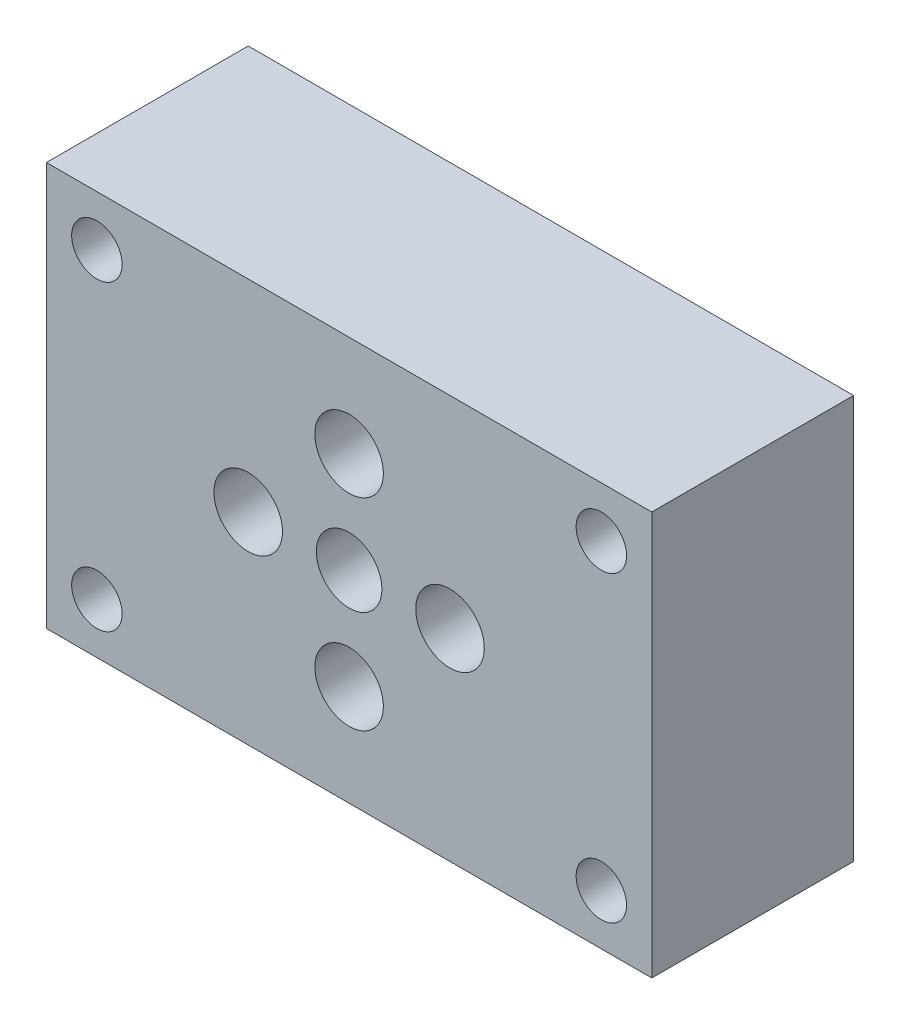
ISO-10303-21;
HEADER;
FILE_DESCRIPTION(('STEP AP214'),'2;1');
FILE_NAME('part.step','',(''),(''),'','','');
FILE_SCHEMA(('AUTOMOTIVE_DESIGN { 1 0 10303 214 1 1 1 1 }'));
ENDSEC;
DATA;
#1=APPLICATION_CONTEXT('core data for automotive mechanical design processes');
#2=APPLICATION_PROTOCOL_DEFINITION('international standard','automotive_design',2000,#1);
#3=PRODUCT_CONTEXT('',#1,'mechanical');
#4=PRODUCT('Part','Part','',(#3));
#5=PRODUCT_RELATED_PRODUCT_CATEGORY('part','',(#4));
#6=PRODUCT_DEFINITION_FORMATION('','',#4);
#7=PRODUCT_DEFINITION_CONTEXT('part definition',#1,'design');
#8=PRODUCT_DEFINITION('design','',#6,#7);
#9=PRODUCT_DEFINITION_SHAPE('','',#8);
#10=(LENGTH_UNIT() NAMED_UNIT(*) SI_UNIT(.MILLI.,.METRE.));
#11=(NAMED_UNIT(*) PLANE_ANGLE_UNIT() SI_UNIT($,.RADIAN.));
#12=(NAMED_UNIT(*) SI_UNIT($,.STERADIAN.) SOLID_ANGLE_UNIT());
#13=UNCERTAINTY_MEASURE_WITH_UNIT(LENGTH_MEASURE(1.E-05),#10,'distance_accuracy_value','');
#14=(GEOMETRIC_REPRESENTATION_CONTEXT(3) GLOBAL_UNCERTAINTY_ASSIGNED_CONTEXT((#13)) GLOBAL_UNIT_ASSIGNED_CONTEXT((#10,
#11,#12)) REPRESENTATION_CONTEXT('',''));
#15=CARTESIAN_POINT('',(0.,0.,0.));
#16=DIRECTION('',(0.,0.,1.));
#17=DIRECTION('',(1.,0.,0.));
#18=AXIS2_PLACEMENT_3D('',#15,#16,#17);
#19=CARTESIAN_POINT('',(0.,0.,25.4));
#20=DIRECTION('',(0.,0.,-1.));
#21=DIRECTION('',(-1.,0.,0.));
#22=AXIS2_PLACEMENT_3D('',#19,#20,#21);
#23=PLANE('',#22);
#24=CARTESIAN_POINT('',(69.8500000000004,6.34999999999999,25.4));
#25=DIRECTION('',(0.,0.,1.));
#26=DIRECTION('',(1.,0.,0.));
#27=AXIS2_PLACEMENT_3D('',#24,#25,#26);
#28=CIRCLE('',#27,3.175);
#29=CARTESIAN_POINT('',(73.0250000000004,6.34999999999999,25.4));
#30=VERTEX_POINT('',#29);
#31=EDGE_CURVE('E144',#30,#30,#28,.T.);
#32=ORIENTED_EDGE('',*,*,#31,.F.);
#33=EDGE_LOOP('',(#32));
#34=FACE_BOUND('',#33,.T.);
#35=CARTESIAN_POINT('',(6.3500000000004,6.34999999999999,25.4));
#36=DIRECTION('',(0.,0.,1.));
#37=DIRECTION('',(1.,0.,0.));
#38=AXIS2_PLACEMENT_3D('',#35,#36,#37);
#39=CIRCLE('',#38,3.175);
#40=CARTESIAN_POINT('',(9.5250000000004,6.34999999999999,25.4));
#41=VERTEX_POINT('',#40);
#42=EDGE_CURVE('E150',#41,#41,#39,.T.);
#43=ORIENTED_EDGE('',*,*,#42,.F.);
#44=EDGE_LOOP('',(#43));
#45=FACE_BOUND('',#44,.T.);
#46=CARTESIAN_POINT('',(69.85,44.45,25.4));
#47=DIRECTION('',(0.,0.,1.));
#48=DIRECTION('',(1.,0.,0.));
#49=AXIS2_PLACEMENT_3D('',#46,#47,#48);
#50=CIRCLE('',#49,3.175);
#51=CARTESIAN_POINT('',(73.025,44.45,25.4));
#52=VERTEX_POINT('',#51);
#53=EDGE_CURVE('E156',#52,#52,#50,.T.);
#54=ORIENTED_EDGE('',*,*,#53,.F.);
#55=EDGE_LOOP('',(#54));
#56=FACE_BOUND('',#55,.T.);
#57=CARTESIAN_POINT('',(6.35,44.45,25.4));
#58=DIRECTION('',(0.,0.,1.));
#59=DIRECTION('',(1.,0.,0.));
#60=AXIS2_PLACEMENT_3D('',#57,#58,#59);
#61=CIRCLE('',#60,3.175);
#62=CARTESIAN_POINT('',(9.525,44.45,25.4));
#63=VERTEX_POINT('',#62);
#64=EDGE_CURVE('E162',#63,#63,#61,.T.);
#65=ORIENTED_EDGE('',*,*,#64,.F.);
#66=EDGE_LOOP('',(#65));
#67=FACE_BOUND('',#66,.T.);
#68=CARTESIAN_POINT('',(38.1,25.4,25.4));
#69=DIRECTION('',(0.,0.,1.));
#70=DIRECTION('',(1.,0.,0.));
#71=AXIS2_PLACEMENT_3D('',#68,#69,#70);
#72=CIRCLE('',#71,4.1275);
#73=CARTESIAN_POINT('',(42.2275,25.4,25.4));
#74=VERTEX_POINT('',#73);
#75=EDGE_CURVE('E138',#74,#74,#72,.T.);
#76=ORIENTED_EDGE('',*,*,#75,.F.);
#77=EDGE_LOOP('',(#76));
#78=FACE_BOUND('',#77,.T.);
#79=DIRECTION('',(0.,-1.,0.));
#80=VECTOR('',#79,1.);
#81=CARTESIAN_POINT('',(0.,0.,25.4));
#82=LINE('',#81,#80);
#83=CARTESIAN_POINT('',(0.,50.8,25.4));
#84=VERTEX_POINT('',#83);
#85=CARTESIAN_POINT('',(0.,0.,25.4));
#86=VERTEX_POINT('',#85);
#87=EDGE_CURVE('E87',#84,#86,#82,.T.);
#88=ORIENTED_EDGE('',*,*,#87,.T.);
#89=DIRECTION('',(1.,0.,0.));
#90=VECTOR('',#89,1.);
#91=CARTESIAN_POINT('',(0.,0.,25.4));
#92=LINE('',#91,#90);
#93=CARTESIAN_POINT('',(76.2,0.,25.4));
#94=VERTEX_POINT('',#93);
#95=EDGE_CURVE('E82',#86,#94,#92,.T.);
#96=ORIENTED_EDGE('',*,*,#95,.T.);
#97=DIRECTION('',(0.,1.,0.));
#98=VECTOR('',#97,1.);
#99=CARTESIAN_POINT('',(76.2,0.,25.4));
#100=LINE('',#99,#98);
#101=CARTESIAN_POINT('',(76.2,50.8,25.4));
#102=VERTEX_POINT('',#101);
#103=EDGE_CURVE('E85',#94,#102,#100,.T.);
#104=ORIENTED_EDGE('',*,*,#103,.T.);
#105=DIRECTION('',(-1.,0.,0.));
#106=VECTOR('',#105,1.);
#107=CARTESIAN_POINT('',(0.,50.8,25.4));
#108=LINE('',#107,#106);
#109=EDGE_CURVE('E52',#102,#84,#108,.T.);
#110=ORIENTED_EDGE('',*,*,#109,.T.);
#111=EDGE_LOOP('',(#88,#96,#104,#110));
#112=FACE_BOUND('',#111,.T.);
#113=CARTESIAN_POINT('',(38.1,38.1,25.4));
#114=DIRECTION('',(0.,0.,1.));
#115=DIRECTION('',(1.,0.,0.));
#116=AXIS2_PLACEMENT_3D('',#113,#114,#115);
#117=CIRCLE('',#116,4.31365531011594);
#118=CARTESIAN_POINT('',(42.4136553101159,38.1,25.4));
#119=VERTEX_POINT('',#118);
#120=EDGE_CURVE('E102',#119,#119,#117,.T.);
#121=ORIENTED_EDGE('',*,*,#120,.F.);
#122=EDGE_LOOP('',(#121));
#123=FACE_BOUND('',#122,.T.);
#124=CARTESIAN_POINT('',(50.8000000000044,25.4000000000044,25.4));
#125=DIRECTION('',(0.,0.,1.));
#126=DIRECTION('',(1.,0.,0.));
#127=AXIS2_PLACEMENT_3D('',#124,#125,#126);
#128=CIRCLE('',#127,4.31365531011594);
#129=CARTESIAN_POINT('',(55.1136553101204,25.4000000000044,25.4));
#130=VERTEX_POINT('',#129);
#131=EDGE_CURVE('E117',#130,#130,#128,.T.);
#132=ORIENTED_EDGE('',*,*,#131,.F.);
#133=EDGE_LOOP('',(#132));
#134=FACE_BOUND('',#133,.T.);
#135=CARTESIAN_POINT('',(38.1000000000088,12.7,25.4));
#136=DIRECTION('',(0.,0.,1.));
#137=DIRECTION('',(1.,0.,0.));
#138=AXIS2_PLACEMENT_3D('',#135,#136,#137);
#139=CIRCLE('',#138,4.31365531011594);
#140=CARTESIAN_POINT('',(42.4136553101248,12.7,25.4));
#141=VERTEX_POINT('',#140);
#142=EDGE_CURVE('E123',#141,#141,#139,.T.);
#143=ORIENTED_EDGE('',*,*,#142,.F.);
#144=EDGE_LOOP('',(#143));
#145=FACE_BOUND('',#144,.T.);
#146=CARTESIAN_POINT('',(25.4000000000044,25.3999999999957,25.4));
#147=DIRECTION('',(0.,0.,1.));
#148=DIRECTION('',(1.,0.,0.));
#149=AXIS2_PLACEMENT_3D('',#146,#147,#148);
#150=CIRCLE('',#149,4.31365531011593);
#151=CARTESIAN_POINT('',(29.7136553101204,25.3999999999957,25.4));
#152=VERTEX_POINT('',#151);
#153=EDGE_CURVE('E129',#152,#152,#150,.T.);
#154=ORIENTED_EDGE('',*,*,#153,.F.);
#155=EDGE_LOOP('',(#154));
#156=FACE_BOUND('',#155,.T.);
#157=ADVANCED_FACE('F35',(#34,#45,#56,#67,#78,#112,#123,#134,#145,#156),#23,.F.);
#158=CARTESIAN_POINT('',(0.,0.,0.));
#159=DIRECTION('',(0.,0.,-1.));
#160=DIRECTION('',(-1.,0.,0.));
#161=AXIS2_PLACEMENT_3D('',#158,#159,#160);
#162=PLANE('',#161);
#163=CARTESIAN_POINT('',(69.8500000000004,6.34999999999999,0.));
#164=DIRECTION('',(0.,0.,1.));
#165=DIRECTION('',(1.,0.,0.));
#166=AXIS2_PLACEMENT_3D('',#163,#164,#165);
#167=CIRCLE('',#166,3.175);
#168=CARTESIAN_POINT('',(73.0250000000004,6.34999999999999,0.));
#169=VERTEX_POINT('',#168);
#170=EDGE_CURVE('E147',#169,#169,#167,.T.);
#171=ORIENTED_EDGE('',*,*,#170,.T.);
#172=EDGE_LOOP('',(#171));
#173=FACE_BOUND('',#172,.T.);
#174=CARTESIAN_POINT('',(6.3500000000004,6.34999999999999,0.));
#175=DIRECTION('',(0.,0.,1.));
#176=DIRECTION('',(1.,0.,0.));
#177=AXIS2_PLACEMENT_3D('',#174,#175,#176);
#178=CIRCLE('',#177,3.175);
#179=CARTESIAN_POINT('',(9.5250000000004,6.34999999999999,0.));
#180=VERTEX_POINT('',#179);
#181=EDGE_CURVE('E153',#180,#180,#178,.T.);
#182=ORIENTED_EDGE('',*,*,#181,.T.);
#183=EDGE_LOOP('',(#182));
#184=FACE_BOUND('',#183,.T.);
#185=CARTESIAN_POINT('',(69.85,44.45,0.));
#186=DIRECTION('',(0.,0.,1.));
#187=DIRECTION('',(1.,0.,0.));
#188=AXIS2_PLACEMENT_3D('',#185,#186,#187);
#189=CIRCLE('',#188,3.175);
#190=CARTESIAN_POINT('',(73.025,44.45,0.));
#191=VERTEX_POINT('',#190);
#192=EDGE_CURVE('E159',#191,#191,#189,.T.);
#193=ORIENTED_EDGE('',*,*,#192,.T.);
#194=EDGE_LOOP('',(#193));
#195=FACE_BOUND('',#194,.T.);
#196=CARTESIAN_POINT('',(6.35,44.45,0.));
#197=DIRECTION('',(0.,0.,1.));
#198=DIRECTION('',(1.,0.,0.));
#199=AXIS2_PLACEMENT_3D('',#196,#197,#198);
#200=CIRCLE('',#199,3.175);
#201=CARTESIAN_POINT('',(9.525,44.45,0.));
#202=VERTEX_POINT('',#201);
#203=EDGE_CURVE('E141',#202,#202,#200,.T.);
#204=ORIENTED_EDGE('',*,*,#203,.T.);
#205=EDGE_LOOP('',(#204));
#206=FACE_BOUND('',#205,.T.);
#207=CARTESIAN_POINT('',(38.1,25.4,0.));
#208=DIRECTION('',(0.,0.,1.));
#209=DIRECTION('',(1.,0.,0.));
#210=AXIS2_PLACEMENT_3D('',#207,#208,#209);
#211=CIRCLE('',#210,4.1275);
#212=CARTESIAN_POINT('',(42.2275,25.4,0.));
#213=VERTEX_POINT('',#212);
#214=EDGE_CURVE('E135',#213,#213,#211,.T.);
#215=ORIENTED_EDGE('',*,*,#214,.T.);
#216=EDGE_LOOP('',(#215));
#217=FACE_BOUND('',#216,.T.);
#218=CARTESIAN_POINT('',(38.1000000000088,12.7,0.));
#219=DIRECTION('',(0.,0.,1.));
#220=DIRECTION('',(1.,0.,0.));
#221=AXIS2_PLACEMENT_3D('',#218,#219,#220);
#222=CIRCLE('',#221,4.31365531011594);
#223=CARTESIAN_POINT('',(42.4136553101248,12.7,0.));
#224=VERTEX_POINT('',#223);
#225=EDGE_CURVE('E126',#224,#224,#222,.T.);
#226=ORIENTED_EDGE('',*,*,#225,.T.);
#227=EDGE_LOOP('',(#226));
#228=FACE_BOUND('',#227,.T.);
#229=CARTESIAN_POINT('',(38.1,38.1,0.));
#230=DIRECTION('',(0.,0.,1.));
#231=DIRECTION('',(1.,0.,0.));
#232=AXIS2_PLACEMENT_3D('',#229,#230,#231);
#233=CIRCLE('',#232,4.31365531011594);
#234=CARTESIAN_POINT('',(42.4136553101159,38.1,0.));
#235=VERTEX_POINT('',#234);
#236=EDGE_CURVE('E114',#235,#235,#233,.T.);
#237=ORIENTED_EDGE('',*,*,#236,.T.);
#238=EDGE_LOOP('',(#237));
#239=FACE_BOUND('',#238,.T.);
#240=DIRECTION('',(0.,-1.,0.));
#241=VECTOR('',#240,1.);
#242=CARTESIAN_POINT('',(0.,0.,0.));
#243=LINE('',#242,#241);
#244=CARTESIAN_POINT('',(0.,50.8,0.));
#245=VERTEX_POINT('',#244);
#246=CARTESIAN_POINT('',(0.,0.,0.));
#247=VERTEX_POINT('',#246);
#248=EDGE_CURVE('E99',#245,#247,#243,.T.);
#249=ORIENTED_EDGE('',*,*,#248,.F.);
#250=DIRECTION('',(-1.,0.,0.));
#251=VECTOR('',#250,1.);
#252=CARTESIAN_POINT('',(0.,50.8,0.));
#253=LINE('',#252,#251);
#254=CARTESIAN_POINT('',(76.2,50.8,0.));
#255=VERTEX_POINT('',#254);
#256=EDGE_CURVE('E75',#255,#245,#253,.T.);
#257=ORIENTED_EDGE('',*,*,#256,.F.);
#258=DIRECTION('',(0.,1.,0.));
#259=VECTOR('',#258,1.);
#260=CARTESIAN_POINT('',(76.2,0.,0.));
#261=LINE('',#260,#259);
#262=CARTESIAN_POINT('',(76.2,0.,0.));
#263=VERTEX_POINT('',#262);
#264=EDGE_CURVE('E69',#263,#255,#261,.T.);
#265=ORIENTED_EDGE('',*,*,#264,.F.);
#266=DIRECTION('',(1.,0.,0.));
#267=VECTOR('',#266,1.);
#268=CARTESIAN_POINT('',(0.,0.,0.));
#269=LINE('',#268,#267);
#270=EDGE_CURVE('E91',#247,#263,#269,.T.);
#271=ORIENTED_EDGE('',*,*,#270,.F.);
#272=EDGE_LOOP('',(#249,#257,#265,#271));
#273=FACE_BOUND('',#272,.T.);
#274=CARTESIAN_POINT('',(50.8000000000044,25.4000000000044,0.));
#275=DIRECTION('',(0.,0.,1.));
#276=DIRECTION('',(1.,0.,0.));
#277=AXIS2_PLACEMENT_3D('',#274,#275,#276);
#278=CIRCLE('',#277,4.31365531011594);
#279=CARTESIAN_POINT('',(55.1136553101204,25.4000000000044,0.));
#280=VERTEX_POINT('',#279);
#281=EDGE_CURVE('E120',#280,#280,#278,.T.);
#282=ORIENTED_EDGE('',*,*,#281,.T.);
#283=EDGE_LOOP('',(#282));
#284=FACE_BOUND('',#283,.T.);
#285=CARTESIAN_POINT('',(25.4000000000044,25.3999999999957,0.));
#286=DIRECTION('',(0.,0.,1.));
#287=DIRECTION('',(1.,0.,0.));
#288=AXIS2_PLACEMENT_3D('',#285,#286,#287);
#289=CIRCLE('',#288,4.31365531011593);
#290=CARTESIAN_POINT('',(29.7136553101204,25.3999999999957,0.));
#291=VERTEX_POINT('',#290);
#292=EDGE_CURVE('E132',#291,#291,#289,.T.);
#293=ORIENTED_EDGE('',*,*,#292,.T.);
#294=EDGE_LOOP('',(#293));
#295=FACE_BOUND('',#294,.T.);
#296=ADVANCED_FACE('F110',(#173,#184,#195,#206,#217,#228,#239,#273,#284,#295),#162,.T.);
#297=CARTESIAN_POINT('',(0.,0.,25.4));
#298=DIRECTION('',(1.,0.,0.));
#299=DIRECTION('',(0.,0.,-1.));
#300=AXIS2_PLACEMENT_3D('',#297,#298,#299);
#301=PLANE('',#300);
#302=ORIENTED_EDGE('',*,*,#248,.T.);
#303=DIRECTION('',(0.,0.,-1.));
#304=VECTOR('',#303,1.);
#305=CARTESIAN_POINT('',(0.,0.,25.4));
#306=LINE('',#305,#304);
#307=EDGE_CURVE('E11',#86,#247,#306,.T.);
#308=ORIENTED_EDGE('',*,*,#307,.F.);
#309=ORIENTED_EDGE('',*,*,#87,.F.);
#310=DIRECTION('',(0.,0.,-1.));
#311=VECTOR('',#310,1.);
#312=CARTESIAN_POINT('',(0.,50.8,25.4));
#313=LINE('',#312,#311);
#314=EDGE_CURVE('E95',#84,#245,#313,.T.);
#315=ORIENTED_EDGE('',*,*,#314,.T.);
#316=EDGE_LOOP('',(#302,#308,#309,#315));
#317=FACE_BOUND('',#316,.T.);
#318=ADVANCED_FACE('F37',(#317),#301,.F.);
#319=CARTESIAN_POINT('',(0.,0.,25.4));
#320=DIRECTION('',(0.,1.,0.));
#321=DIRECTION('',(0.,0.,1.));
#322=AXIS2_PLACEMENT_3D('',#319,#320,#321);
#323=PLANE('',#322);
#324=ORIENTED_EDGE('',*,*,#270,.T.);
#325=DIRECTION('',(0.,0.,-1.));
#326=VECTOR('',#325,1.);
#327=CARTESIAN_POINT('',(76.2,0.,25.4));
#328=LINE('',#327,#326);
#329=EDGE_CURVE('E44',#94,#263,#328,.T.);
#330=ORIENTED_EDGE('',*,*,#329,.F.);
#331=ORIENTED_EDGE('',*,*,#95,.F.);
#332=ORIENTED_EDGE('',*,*,#307,.T.);
#333=EDGE_LOOP('',(#324,#330,#331,#332));
#334=FACE_BOUND('',#333,.T.);
#335=ADVANCED_FACE('F90',(#334),#323,.F.);
#336=CARTESIAN_POINT('',(76.2,0.,25.4));
#337=DIRECTION('',(-1.,0.,0.));
#338=DIRECTION('',(0.,0.,1.));
#339=AXIS2_PLACEMENT_3D('',#336,#337,#338);
#340=PLANE('',#339);
#341=ORIENTED_EDGE('',*,*,#264,.T.);
#342=DIRECTION('',(0.,0.,-1.));
#343=VECTOR('',#342,1.);
#344=CARTESIAN_POINT('',(76.2,50.8,25.4));
#345=LINE('',#344,#343);
#346=EDGE_CURVE('E92',#102,#255,#345,.T.);
#347=ORIENTED_EDGE('',*,*,#346,.F.);
#348=ORIENTED_EDGE('',*,*,#103,.F.);
#349=ORIENTED_EDGE('',*,*,#329,.T.);
#350=EDGE_LOOP('',(#341,#347,#348,#349));
#351=FACE_BOUND('',#350,.T.);
#352=ADVANCED_FACE('F93',(#351),#340,.F.);
#353=CARTESIAN_POINT('',(0.,50.8,25.4));
#354=DIRECTION('',(0.,-1.,0.));
#355=DIRECTION('',(0.,0.,-1.));
#356=AXIS2_PLACEMENT_3D('',#353,#354,#355);
#357=PLANE('',#356);
#358=ORIENTED_EDGE('',*,*,#256,.T.);
#359=ORIENTED_EDGE('',*,*,#314,.F.);
#360=ORIENTED_EDGE('',*,*,#109,.F.);
#361=ORIENTED_EDGE('',*,*,#346,.T.);
#362=EDGE_LOOP('',(#358,#359,#360,#361));
#363=FACE_BOUND('',#362,.T.);
#364=ADVANCED_FACE('F107',(#363),#357,.F.);
#365=CARTESIAN_POINT('',(38.1,38.1,25.4));
#366=DIRECTION('',(0.,0.,-1.));
#367=DIRECTION('',(-1.,0.,0.));
#368=AXIS2_PLACEMENT_3D('',#365,#366,#367);
#369=CYLINDRICAL_SURFACE('',#368,4.31365531011594);
#370=ORIENTED_EDGE('',*,*,#120,.T.);
#371=EDGE_LOOP('',(#370));
#372=FACE_BOUND('',#371,.T.);
#373=ORIENTED_EDGE('',*,*,#236,.F.);
#374=EDGE_LOOP('',(#373));
#375=FACE_BOUND('',#374,.T.);
#376=ADVANCED_FACE('F205',(#372,#375),#369,.F.);
#377=CARTESIAN_POINT('',(50.8000000000044,25.4000000000044,25.4));
#378=DIRECTION('',(0.,0.,-1.));
#379=DIRECTION('',(-1.,0.,0.));
#380=AXIS2_PLACEMENT_3D('',#377,#378,#379);
#381=CYLINDRICAL_SURFACE('',#380,4.31365531011594);
#382=ORIENTED_EDGE('',*,*,#131,.T.);
#383=EDGE_LOOP('',(#382));
#384=FACE_BOUND('',#383,.T.);
#385=ORIENTED_EDGE('',*,*,#281,.F.);
#386=EDGE_LOOP('',(#385));
#387=FACE_BOUND('',#386,.T.);
#388=ADVANCED_FACE('F201',(#384,#387),#381,.F.);
#389=CARTESIAN_POINT('',(38.1000000000088,12.7,25.4));
#390=DIRECTION('',(0.,0.,-1.));
#391=DIRECTION('',(-1.,0.,0.));
#392=AXIS2_PLACEMENT_3D('',#389,#390,#391);
#393=CYLINDRICAL_SURFACE('',#392,4.31365531011594);
#394=ORIENTED_EDGE('',*,*,#142,.T.);
#395=EDGE_LOOP('',(#394));
#396=FACE_BOUND('',#395,.T.);
#397=ORIENTED_EDGE('',*,*,#225,.F.);
#398=EDGE_LOOP('',(#397));
#399=FACE_BOUND('',#398,.T.);
#400=ADVANCED_FACE('F191',(#396,#399),#393,.F.);
#401=CARTESIAN_POINT('',(25.4000000000044,25.3999999999957,25.4));
#402=DIRECTION('',(0.,0.,-1.));
#403=DIRECTION('',(-1.,0.,0.));
#404=AXIS2_PLACEMENT_3D('',#401,#402,#403);
#405=CYLINDRICAL_SURFACE('',#404,4.31365531011593);
#406=ORIENTED_EDGE('',*,*,#153,.T.);
#407=EDGE_LOOP('',(#406));
#408=FACE_BOUND('',#407,.T.);
#409=ORIENTED_EDGE('',*,*,#292,.F.);
#410=EDGE_LOOP('',(#409));
#411=FACE_BOUND('',#410,.T.);
#412=ADVANCED_FACE('F185',(#408,#411),#405,.F.);
#413=CARTESIAN_POINT('',(38.1,25.4,0.));
#414=DIRECTION('',(0.,0.,1.));
#415=DIRECTION('',(1.,0.,0.));
#416=AXIS2_PLACEMENT_3D('',#413,#414,#415);
#417=CYLINDRICAL_SURFACE('',#416,4.1275);
#418=ORIENTED_EDGE('',*,*,#214,.F.);
#419=EDGE_LOOP('',(#418));
#420=FACE_BOUND('',#419,.T.);
#421=ORIENTED_EDGE('',*,*,#75,.T.);
#422=EDGE_LOOP('',(#421));
#423=FACE_BOUND('',#422,.T.);
#424=ADVANCED_FACE('F174',(#420,#423),#417,.F.);
#425=CARTESIAN_POINT('',(6.35,44.45,0.));
#426=DIRECTION('',(0.,0.,1.));
#427=DIRECTION('',(1.,0.,0.));
#428=AXIS2_PLACEMENT_3D('',#425,#426,#427);
#429=CYLINDRICAL_SURFACE('',#428,3.175);
#430=ORIENTED_EDGE('',*,*,#203,.F.);
#431=EDGE_LOOP('',(#430));
#432=FACE_BOUND('',#431,.T.);
#433=ORIENTED_EDGE('',*,*,#64,.T.);
#434=EDGE_LOOP('',(#433));
#435=FACE_BOUND('',#434,.T.);
#436=ADVANCED_FACE('F170',(#432,#435),#429,.F.);
#437=CARTESIAN_POINT('',(69.85,44.45,0.));
#438=DIRECTION('',(0.,0.,1.));
#439=DIRECTION('',(1.,0.,0.));
#440=AXIS2_PLACEMENT_3D('',#437,#438,#439);
#441=CYLINDRICAL_SURFACE('',#440,3.175);
#442=ORIENTED_EDGE('',*,*,#192,.F.);
#443=EDGE_LOOP('',(#442));
#444=FACE_BOUND('',#443,.T.);
#445=ORIENTED_EDGE('',*,*,#53,.T.);
#446=EDGE_LOOP('',(#445));
#447=FACE_BOUND('',#446,.T.);
#448=ADVANCED_FACE('F173',(#444,#447),#441,.F.);
#449=CARTESIAN_POINT('',(6.3500000000004,6.34999999999999,0.));
#450=DIRECTION('',(0.,0.,1.));
#451=DIRECTION('',(1.,0.,0.));
#452=AXIS2_PLACEMENT_3D('',#449,#450,#451);
#453=CYLINDRICAL_SURFACE('',#452,3.175);
#454=ORIENTED_EDGE('',*,*,#181,.F.);
#455=EDGE_LOOP('',(#454));
#456=FACE_BOUND('',#455,.T.);
#457=ORIENTED_EDGE('',*,*,#42,.T.);
#458=EDGE_LOOP('',(#457));
#459=FACE_BOUND('',#458,.T.);
#460=ADVANCED_FACE('F293',(#456,#459),#453,.F.);
#461=CARTESIAN_POINT('',(69.8500000000004,6.34999999999999,0.));
#462=DIRECTION('',(0.,0.,1.));
#463=DIRECTION('',(1.,0.,0.));
#464=AXIS2_PLACEMENT_3D('',#461,#462,#463);
#465=CYLINDRICAL_SURFACE('',#464,3.175);
#466=ORIENTED_EDGE('',*,*,#170,.F.);
#467=EDGE_LOOP('',(#466));
#468=FACE_BOUND('',#467,.T.);
#469=ORIENTED_EDGE('',*,*,#31,.T.);
#470=EDGE_LOOP('',(#469));
#471=FACE_BOUND('',#470,.T.);
#472=ADVANCED_FACE('F196',(#468,#471),#465,.F.);
#473=CLOSED_SHELL('',(#157,#296,#318,#335,#352,#364,#376,#388,#400,#412,#424,#436,#448,#460,#472));
#474=MANIFOLD_SOLID_BREP('B2',#473);
#475=ADVANCED_BREP_SHAPE_REPRESENTATION('',(#18,#474),#14);
#476=SHAPE_DEFINITION_REPRESENTATION(#9,#475);
ENDSEC;
END-ISO-10303-21;
